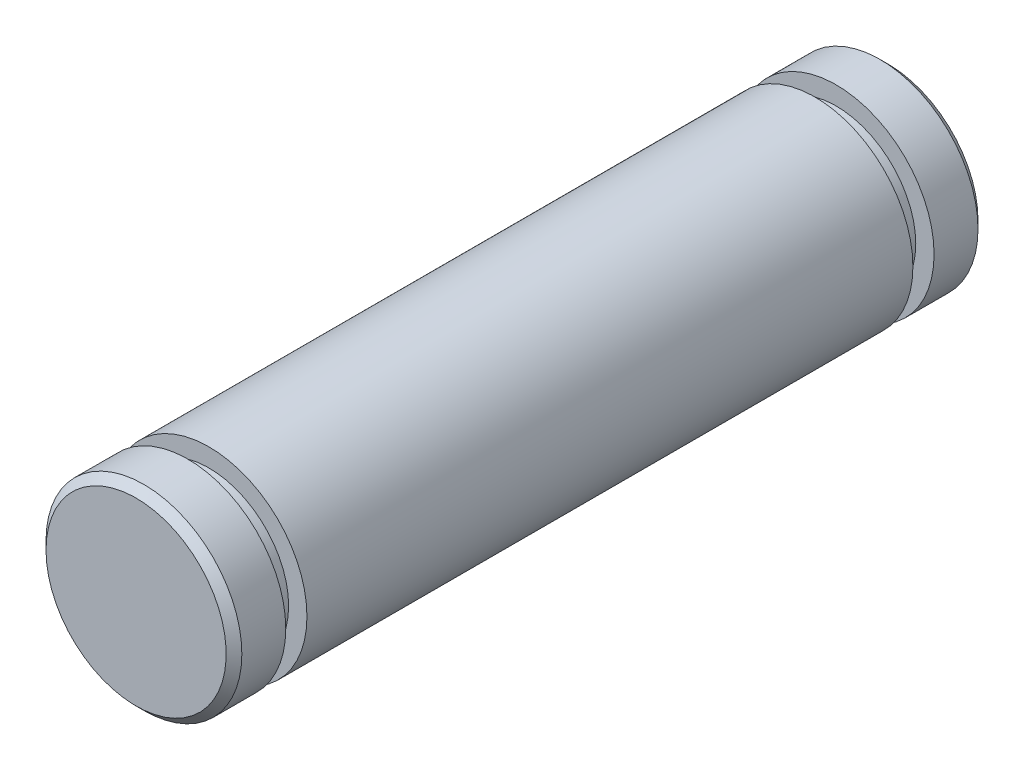
ISO-10303-21;
HEADER;
FILE_DESCRIPTION(('STEP AP214'),'2;1');
FILE_NAME('part.step','',(''),(''),'','','');
FILE_SCHEMA(('AUTOMOTIVE_DESIGN { 1 0 10303 214 1 1 1 1 }'));
ENDSEC;
DATA;
#1=APPLICATION_CONTEXT('core data for automotive mechanical design processes');
#2=APPLICATION_PROTOCOL_DEFINITION('international standard','automotive_design',2000,#1);
#3=PRODUCT_CONTEXT('',#1,'mechanical');
#4=PRODUCT('Part','Part','',(#3));
#5=PRODUCT_RELATED_PRODUCT_CATEGORY('part','',(#4));
#6=PRODUCT_DEFINITION_FORMATION('','',#4);
#7=PRODUCT_DEFINITION_CONTEXT('part definition',#1,'design');
#8=PRODUCT_DEFINITION('design','',#6,#7);
#9=PRODUCT_DEFINITION_SHAPE('','',#8);
#10=(LENGTH_UNIT() NAMED_UNIT(*) SI_UNIT(.MILLI.,.METRE.));
#11=(NAMED_UNIT(*) PLANE_ANGLE_UNIT() SI_UNIT($,.RADIAN.));
#12=(NAMED_UNIT(*) SI_UNIT($,.STERADIAN.) SOLID_ANGLE_UNIT());
#13=UNCERTAINTY_MEASURE_WITH_UNIT(LENGTH_MEASURE(1.E-05),#10,'distance_accuracy_value','');
#14=(GEOMETRIC_REPRESENTATION_CONTEXT(3) GLOBAL_UNCERTAINTY_ASSIGNED_CONTEXT((#13)) GLOBAL_UNIT_ASSIGNED_CONTEXT((#10,
#11,#12)) REPRESENTATION_CONTEXT('',''));
#15=CARTESIAN_POINT('',(0.,0.,0.));
#16=DIRECTION('',(0.,0.,1.));
#17=DIRECTION('',(1.,0.,0.));
#18=AXIS2_PLACEMENT_3D('',#15,#16,#17);
#19=CARTESIAN_POINT('',(0.,-4.37642,-18.2626));
#20=DIRECTION('',(0.,0.,1.));
#21=DIRECTION('',(1.,0.,0.));
#22=AXIS2_PLACEMENT_3D('',#19,#20,#21);
#23=PLANE('',#22);
#24=CARTESIAN_POINT('',(0.,0.,-18.2625999999004));
#25=DIRECTION('',(0.,0.,1.));
#26=DIRECTION('',(1.,0.,0.));
#27=AXIS2_PLACEMENT_3D('',#24,#25,#26);
#28=CIRCLE('',#27,4.3764199999714);
#29=CARTESIAN_POINT('',(4.3764199999714,0.,-18.2625999999004));
#30=VERTEX_POINT('',#29);
#31=EDGE_CURVE('E17',#30,#30,#28,.T.);
#32=ORIENTED_EDGE('',*,*,#31,.F.);
#33=EDGE_LOOP('',(#32));
#34=FACE_BOUND('',#33,.T.);
#35=ADVANCED_FACE('F14',(#34),#23,.F.);
#36=CARTESIAN_POINT('',(0.,0.,18.2626));
#37=DIRECTION('',(0.,0.,-1.));
#38=DIRECTION('',(-1.,0.,0.));
#39=AXIS2_PLACEMENT_3D('',#36,#37,#38);
#40=PLANE('',#39);
#41=CARTESIAN_POINT('',(0.,0.,18.262600000071));
#42=DIRECTION('',(0.,0.,-1.));
#43=DIRECTION('',(-1.,0.,0.));
#44=AXIS2_PLACEMENT_3D('',#41,#42,#43);
#45=CIRCLE('',#44,4.37642000002825);
#46=CARTESIAN_POINT('',(-4.37642000002825,0.,18.262600000071));
#47=VERTEX_POINT('',#46);
#48=EDGE_CURVE('E49',#47,#47,#45,.T.);
#49=ORIENTED_EDGE('',*,*,#48,.F.);
#50=EDGE_LOOP('',(#49));
#51=FACE_BOUND('',#50,.T.);
#52=ADVANCED_FACE('F61',(#51),#40,.F.);
#53=CARTESIAN_POINT('',(0.,0.,-17.8815999998392));
#54=DIRECTION('',(0.,0.,1.));
#55=DIRECTION('',(1.,0.,0.));
#56=AXIS2_PLACEMENT_3D('',#53,#54,#55);
#57=CONICAL_SURFACE('',#56,4.75742000003265,0.785398163397448);
#58=ORIENTED_EDGE('',*,*,#31,.T.);
#59=EDGE_LOOP('',(#58));
#60=FACE_BOUND('',#59,.T.);
#61=CARTESIAN_POINT('',(0.,0.,-17.8816));
#62=DIRECTION('',(0.,0.,1.));
#63=DIRECTION('',(1.,0.,0.));
#64=AXIS2_PLACEMENT_3D('',#61,#62,#63);
#65=CIRCLE('',#64,4.75742);
#66=CARTESIAN_POINT('',(4.75742,0.,-17.8816));
#67=VERTEX_POINT('',#66);
#68=EDGE_CURVE('E29',#67,#67,#65,.T.);
#69=ORIENTED_EDGE('',*,*,#68,.F.);
#70=EDGE_LOOP('',(#69));
#71=FACE_BOUND('',#70,.T.);
#72=ADVANCED_FACE('F57',(#60,#71),#57,.T.);
#73=CARTESIAN_POINT('',(0.,0.,17.8816000001802));
#74=DIRECTION('',(0.,0.,-1.));
#75=DIRECTION('',(-1.,0.,0.));
#76=AXIS2_PLACEMENT_3D('',#73,#74,#75);
#77=CONICAL_SURFACE('',#76,4.75741999991897,0.785398163397448);
#78=ORIENTED_EDGE('',*,*,#48,.T.);
#79=EDGE_LOOP('',(#78));
#80=FACE_BOUND('',#79,.T.);
#81=CARTESIAN_POINT('',(0.,0.,17.8816));
#82=DIRECTION('',(0.,0.,1.));
#83=DIRECTION('',(1.,0.,0.));
#84=AXIS2_PLACEMENT_3D('',#81,#82,#83);
#85=CIRCLE('',#84,4.75742);
#86=CARTESIAN_POINT('',(4.75742,0.,17.8816));
#87=VERTEX_POINT('',#86);
#88=EDGE_CURVE('E48',#87,#87,#85,.F.);
#89=ORIENTED_EDGE('',*,*,#88,.F.);
#90=EDGE_LOOP('',(#89));
#91=FACE_BOUND('',#90,.T.);
#92=ADVANCED_FACE('F105',(#80,#91),#77,.T.);
#93=CARTESIAN_POINT('',(0.,0.,-18.2626));
#94=DIRECTION('',(0.,0.,1.));
#95=DIRECTION('',(1.,0.,0.));
#96=AXIS2_PLACEMENT_3D('',#93,#94,#95);
#97=CYLINDRICAL_SURFACE('',#96,4.75742);
#98=CARTESIAN_POINT('',(0.,0.,-15.748));
#99=DIRECTION('',(0.,0.,1.));
#100=DIRECTION('',(1.,0.,0.));
#101=AXIS2_PLACEMENT_3D('',#98,#99,#100);
#102=CIRCLE('',#101,4.75742);
#103=CARTESIAN_POINT('',(4.75742,0.,-15.748));
#104=VERTEX_POINT('',#103);
#105=EDGE_CURVE('E46',#104,#104,#102,.F.);
#106=ORIENTED_EDGE('',*,*,#105,.T.);
#107=EDGE_LOOP('',(#106));
#108=FACE_BOUND('',#107,.T.);
#109=ORIENTED_EDGE('',*,*,#68,.T.);
#110=EDGE_LOOP('',(#109));
#111=FACE_BOUND('',#110,.T.);
#112=ADVANCED_FACE('F101',(#108,#111),#97,.T.);
#113=CARTESIAN_POINT('',(0.,0.,-18.2626));
#114=DIRECTION('',(0.,0.,1.));
#115=DIRECTION('',(1.,0.,0.));
#116=AXIS2_PLACEMENT_3D('',#113,#114,#115);
#117=CYLINDRICAL_SURFACE('',#116,4.75742);
#118=ORIENTED_EDGE('',*,*,#88,.T.);
#119=EDGE_LOOP('',(#118));
#120=FACE_BOUND('',#119,.T.);
#121=CARTESIAN_POINT('',(0.,0.,15.748));
#122=DIRECTION('',(0.,0.,1.));
#123=DIRECTION('',(1.,0.,0.));
#124=AXIS2_PLACEMENT_3D('',#121,#122,#123);
#125=CIRCLE('',#124,4.75742);
#126=CARTESIAN_POINT('',(4.75742,0.,15.748));
#127=VERTEX_POINT('',#126);
#128=EDGE_CURVE('E43',#127,#127,#125,.T.);
#129=ORIENTED_EDGE('',*,*,#128,.T.);
#130=EDGE_LOOP('',(#129));
#131=FACE_BOUND('',#130,.T.);
#132=ADVANCED_FACE('F97',(#120,#131),#117,.T.);
#133=CARTESIAN_POINT('',(0.,-3.86715,-15.748));
#134=DIRECTION('',(0.,0.,-1.));
#135=DIRECTION('',(-1.,0.,0.));
#136=AXIS2_PLACEMENT_3D('',#133,#134,#135);
#137=PLANE('',#136);
#138=CARTESIAN_POINT('',(0.,0.,-15.748));
#139=DIRECTION('',(0.,0.,1.));
#140=DIRECTION('',(1.,0.,0.));
#141=AXIS2_PLACEMENT_3D('',#138,#139,#140);
#142=CIRCLE('',#141,3.86715);
#143=CARTESIAN_POINT('',(3.86715,0.,-15.748));
#144=VERTEX_POINT('',#143);
#145=EDGE_CURVE('E40',#144,#144,#142,.T.);
#146=ORIENTED_EDGE('',*,*,#145,.F.);
#147=EDGE_LOOP('',(#146));
#148=FACE_BOUND('',#147,.T.);
#149=ORIENTED_EDGE('',*,*,#105,.F.);
#150=EDGE_LOOP('',(#149));
#151=FACE_BOUND('',#150,.T.);
#152=ADVANCED_FACE('F93',(#148,#151),#137,.F.);
#153=CARTESIAN_POINT('',(0.,-4.75742,15.748));
#154=DIRECTION('',(0.,0.,1.));
#155=DIRECTION('',(1.,0.,0.));
#156=AXIS2_PLACEMENT_3D('',#153,#154,#155);
#157=PLANE('',#156);
#158=ORIENTED_EDGE('',*,*,#128,.F.);
#159=EDGE_LOOP('',(#158));
#160=FACE_BOUND('',#159,.T.);
#161=CARTESIAN_POINT('',(0.,0.,15.748));
#162=DIRECTION('',(0.,0.,1.));
#163=DIRECTION('',(1.,0.,0.));
#164=AXIS2_PLACEMENT_3D('',#161,#162,#163);
#165=CIRCLE('',#164,3.86715);
#166=CARTESIAN_POINT('',(3.86715,0.,15.748));
#167=VERTEX_POINT('',#166);
#168=EDGE_CURVE('E37',#167,#167,#165,.F.);
#169=ORIENTED_EDGE('',*,*,#168,.F.);
#170=EDGE_LOOP('',(#169));
#171=FACE_BOUND('',#170,.T.);
#172=ADVANCED_FACE('F89',(#160,#171),#157,.F.);
#173=CARTESIAN_POINT('',(0.,0.,-18.2626));
#174=DIRECTION('',(0.,0.,1.));
#175=DIRECTION('',(1.,0.,0.));
#176=AXIS2_PLACEMENT_3D('',#173,#174,#175);
#177=CYLINDRICAL_SURFACE('',#176,3.86715);
#178=CARTESIAN_POINT('',(0.,0.,-14.7193));
#179=DIRECTION('',(0.,0.,1.));
#180=DIRECTION('',(1.,0.,0.));
#181=AXIS2_PLACEMENT_3D('',#178,#179,#180);
#182=CIRCLE('',#181,3.86715);
#183=CARTESIAN_POINT('',(3.86715,0.,-14.7193));
#184=VERTEX_POINT('',#183);
#185=EDGE_CURVE('E34',#184,#184,#182,.F.);
#186=ORIENTED_EDGE('',*,*,#185,.T.);
#187=EDGE_LOOP('',(#186));
#188=FACE_BOUND('',#187,.T.);
#189=ORIENTED_EDGE('',*,*,#145,.T.);
#190=EDGE_LOOP('',(#189));
#191=FACE_BOUND('',#190,.T.);
#192=ADVANCED_FACE('F85',(#188,#191),#177,.T.);
#193=CARTESIAN_POINT('',(0.,0.,-18.2626));
#194=DIRECTION('',(0.,0.,1.));
#195=DIRECTION('',(1.,0.,0.));
#196=AXIS2_PLACEMENT_3D('',#193,#194,#195);
#197=CYLINDRICAL_SURFACE('',#196,3.86715);
#198=ORIENTED_EDGE('',*,*,#168,.T.);
#199=EDGE_LOOP('',(#198));
#200=FACE_BOUND('',#199,.T.);
#201=CARTESIAN_POINT('',(0.,0.,14.7193));
#202=DIRECTION('',(0.,0.,1.));
#203=DIRECTION('',(1.,0.,0.));
#204=AXIS2_PLACEMENT_3D('',#201,#202,#203);
#205=CIRCLE('',#204,3.86715);
#206=CARTESIAN_POINT('',(3.86715,0.,14.7193));
#207=VERTEX_POINT('',#206);
#208=EDGE_CURVE('E26',#207,#207,#205,.T.);
#209=ORIENTED_EDGE('',*,*,#208,.T.);
#210=EDGE_LOOP('',(#209));
#211=FACE_BOUND('',#210,.T.);
#212=ADVANCED_FACE('F81',(#200,#211),#197,.T.);
#213=CARTESIAN_POINT('',(0.,-4.75742,-14.7193));
#214=DIRECTION('',(0.,0.,1.));
#215=DIRECTION('',(1.,0.,0.));
#216=AXIS2_PLACEMENT_3D('',#213,#214,#215);
#217=PLANE('',#216);
#218=CARTESIAN_POINT('',(0.,0.,-14.7193));
#219=DIRECTION('',(0.,0.,1.));
#220=DIRECTION('',(1.,0.,0.));
#221=AXIS2_PLACEMENT_3D('',#218,#219,#220);
#222=CIRCLE('',#221,4.75742);
#223=CARTESIAN_POINT('',(4.75742,0.,-14.7193));
#224=VERTEX_POINT('',#223);
#225=EDGE_CURVE('E21',#224,#224,#222,.T.);
#226=ORIENTED_EDGE('',*,*,#225,.F.);
#227=EDGE_LOOP('',(#226));
#228=FACE_BOUND('',#227,.T.);
#229=ORIENTED_EDGE('',*,*,#185,.F.);
#230=EDGE_LOOP('',(#229));
#231=FACE_BOUND('',#230,.T.);
#232=ADVANCED_FACE('F75',(#228,#231),#217,.F.);
#233=CARTESIAN_POINT('',(0.,-3.86715,14.7193));
#234=DIRECTION('',(0.,0.,-1.));
#235=DIRECTION('',(-1.,0.,0.));
#236=AXIS2_PLACEMENT_3D('',#233,#234,#235);
#237=PLANE('',#236);
#238=ORIENTED_EDGE('',*,*,#208,.F.);
#239=EDGE_LOOP('',(#238));
#240=FACE_BOUND('',#239,.T.);
#241=CARTESIAN_POINT('',(0.,0.,14.7193));
#242=DIRECTION('',(0.,0.,1.));
#243=DIRECTION('',(1.,0.,0.));
#244=AXIS2_PLACEMENT_3D('',#241,#242,#243);
#245=CIRCLE('',#244,4.75742);
#246=CARTESIAN_POINT('',(4.75742,0.,14.7193));
#247=VERTEX_POINT('',#246);
#248=EDGE_CURVE('E9',#247,#247,#245,.F.);
#249=ORIENTED_EDGE('',*,*,#248,.F.);
#250=EDGE_LOOP('',(#249));
#251=FACE_BOUND('',#250,.T.);
#252=ADVANCED_FACE('F69',(#240,#251),#237,.F.);
#253=CARTESIAN_POINT('',(0.,0.,-18.2626));
#254=DIRECTION('',(0.,0.,1.));
#255=DIRECTION('',(1.,0.,0.));
#256=AXIS2_PLACEMENT_3D('',#253,#254,#255);
#257=CYLINDRICAL_SURFACE('',#256,4.75742);
#258=ORIENTED_EDGE('',*,*,#225,.T.);
#259=EDGE_LOOP('',(#258));
#260=FACE_BOUND('',#259,.T.);
#261=ORIENTED_EDGE('',*,*,#248,.T.);
#262=EDGE_LOOP('',(#261));
#263=FACE_BOUND('',#262,.T.);
#264=ADVANCED_FACE('F67',(#260,#263),#257,.T.);
#265=CLOSED_SHELL('',(#35,#52,#72,#92,#112,#132,#152,#172,#192,#212,#232,#252,#264));
#266=MANIFOLD_SOLID_BREP('B1',#265);
#267=ADVANCED_BREP_SHAPE_REPRESENTATION('',(#18,#266),#14);
#268=SHAPE_DEFINITION_REPRESENTATION(#9,#267);
ENDSEC;
END-ISO-10303-21;
